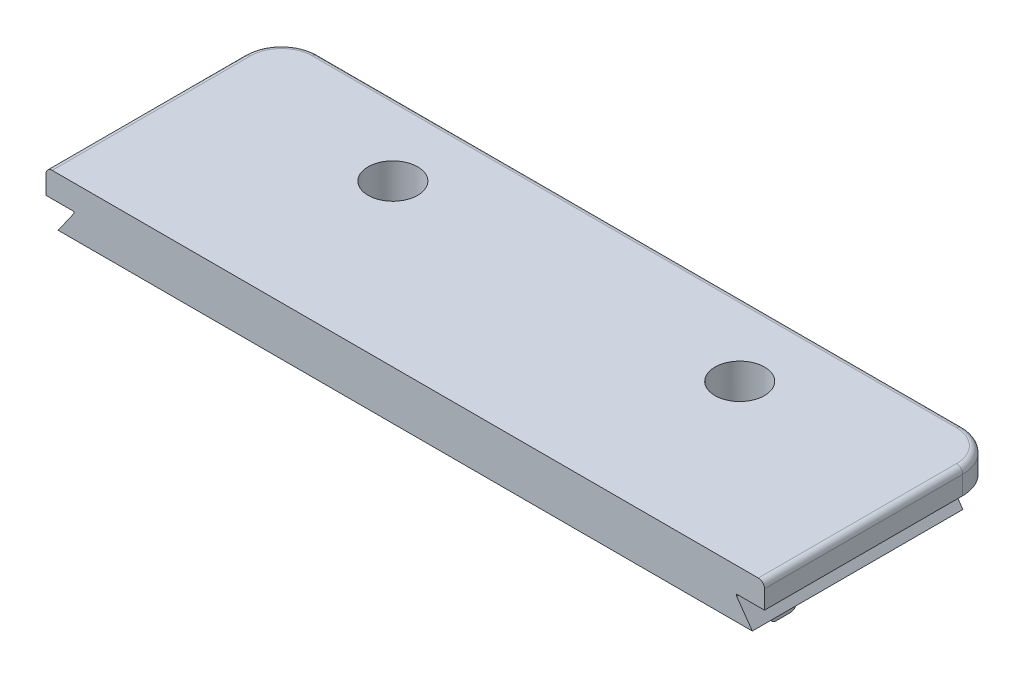
ISO-10303-21;
HEADER;
FILE_DESCRIPTION(('STEP AP214'),'2;1');
FILE_NAME('part.step','',(''),(''),'','','');
FILE_SCHEMA(('AUTOMOTIVE_DESIGN { 1 0 10303 214 1 1 1 1 }'));
ENDSEC;
DATA;
#1=APPLICATION_CONTEXT('core data for automotive mechanical design processes');
#2=APPLICATION_PROTOCOL_DEFINITION('international standard','automotive_design',2000,#1);
#3=PRODUCT_CONTEXT('',#1,'mechanical');
#4=PRODUCT('Part','Part','',(#3));
#5=PRODUCT_RELATED_PRODUCT_CATEGORY('part','',(#4));
#6=PRODUCT_DEFINITION_FORMATION('','',#4);
#7=PRODUCT_DEFINITION_CONTEXT('part definition',#1,'design');
#8=PRODUCT_DEFINITION('design','',#6,#7);
#9=PRODUCT_DEFINITION_SHAPE('','',#8);
#10=(LENGTH_UNIT() NAMED_UNIT(*) SI_UNIT(.MILLI.,.METRE.));
#11=(NAMED_UNIT(*) PLANE_ANGLE_UNIT() SI_UNIT($,.RADIAN.));
#12=(NAMED_UNIT(*) SI_UNIT($,.STERADIAN.) SOLID_ANGLE_UNIT());
#13=UNCERTAINTY_MEASURE_WITH_UNIT(LENGTH_MEASURE(1.E-05),#10,'distance_accuracy_value','');
#14=(GEOMETRIC_REPRESENTATION_CONTEXT(3) GLOBAL_UNCERTAINTY_ASSIGNED_CONTEXT((#13)) GLOBAL_UNIT_ASSIGNED_CONTEXT((#10,
#11,#12)) REPRESENTATION_CONTEXT('',''));
#15=CARTESIAN_POINT('',(0.,0.,0.));
#16=DIRECTION('',(0.,0.,1.));
#17=DIRECTION('',(1.,0.,0.));
#18=AXIS2_PLACEMENT_3D('',#15,#16,#17);
#19=CARTESIAN_POINT('',(-28.0162186510252,27.2,-75.1343487105515));
#20=DIRECTION('',(0.,-1.,0.));
#21=DIRECTION('',(1.,0.,0.));
#22=AXIS2_PLACEMENT_3D('',#19,#20,#21);
#23=PLANE('',#22);
#24=CARTESIAN_POINT('',(14.,27.2,-13.));
#25=DIRECTION('',(0.,-1.,0.));
#26=DIRECTION('',(1.,0.,0.));
#27=AXIS2_PLACEMENT_3D('',#24,#25,#26);
#28=CIRCLE('',#27,2.);
#29=CARTESIAN_POINT('',(16.,27.2,-13.));
#30=VERTEX_POINT('',#29);
#31=EDGE_CURVE('E412',#30,#30,#28,.F.);
#32=ORIENTED_EDGE('',*,*,#31,.T.);
#33=EDGE_LOOP('',(#32));
#34=FACE_BOUND('',#33,.T.);
#35=CARTESIAN_POINT('',(-14.,27.2,-13.));
#36=DIRECTION('',(0.,-1.,0.));
#37=DIRECTION('',(1.,0.,0.));
#38=AXIS2_PLACEMENT_3D('',#35,#36,#37);
#39=CIRCLE('',#38,2.);
#40=CARTESIAN_POINT('',(-12.,27.2,-13.));
#41=VERTEX_POINT('',#40);
#42=EDGE_CURVE('E406',#41,#41,#39,.F.);
#43=ORIENTED_EDGE('',*,*,#42,.T.);
#44=EDGE_LOOP('',(#43));
#45=FACE_BOUND('',#44,.T.);
#46=DIRECTION('',(1.,0.,0.));
#47=VECTOR('',#46,1.);
#48=CARTESIAN_POINT('',(28.0162186510252,27.2,-3.5));
#49=LINE('',#48,#47);
#50=CARTESIAN_POINT('',(-28.0162186510252,27.2,-3.5));
#51=VERTEX_POINT('',#50);
#52=CARTESIAN_POINT('',(28.0162186510252,27.2,-3.5));
#53=VERTEX_POINT('',#52);
#54=EDGE_CURVE('E208',#51,#53,#49,.T.);
#55=ORIENTED_EDGE('',*,*,#54,.F.);
#56=DIRECTION('',(0.,0.,1.));
#57=VECTOR('',#56,1.);
#58=CARTESIAN_POINT('',(-28.0162186510252,27.2,-75.1343487105515));
#59=LINE('',#58,#57);
#60=CARTESIAN_POINT('',(-28.0162186510252,27.2,-17.));
#61=VERTEX_POINT('',#60);
#62=EDGE_CURVE('E206',#61,#51,#59,.T.);
#63=ORIENTED_EDGE('',*,*,#62,.F.);
#64=DIRECTION('',(1.,0.,0.));
#65=VECTOR('',#64,1.);
#66=CARTESIAN_POINT('',(-28.0162186510252,27.2,-17.));
#67=LINE('',#66,#65);
#68=CARTESIAN_POINT('',(28.0162186510252,27.2,-17.));
#69=VERTEX_POINT('',#68);
#70=EDGE_CURVE('E299',#61,#69,#67,.T.);
#71=ORIENTED_EDGE('',*,*,#70,.T.);
#72=DIRECTION('',(0.,0.,1.));
#73=VECTOR('',#72,1.);
#74=CARTESIAN_POINT('',(28.0162186510252,27.2,-75.1343487105515));
#75=LINE('',#74,#73);
#76=EDGE_CURVE('E298',#69,#53,#75,.T.);
#77=ORIENTED_EDGE('',*,*,#76,.T.);
#78=EDGE_LOOP('',(#55,#63,#71,#77));
#79=FACE_BOUND('',#78,.T.);
#80=ADVANCED_FACE('F47',(#34,#45,#79),#23,.T.);
#81=CARTESIAN_POINT('',(0.,0.0499999999999902,-17.));
#82=DIRECTION('',(0.,0.,-1.));
#83=DIRECTION('',(-1.,0.,0.));
#84=AXIS2_PLACEMENT_3D('',#81,#82,#83);
#85=PLANE('',#84);
#86=DIRECTION('',(-1.,0.,0.));
#87=VECTOR('',#86,1.);
#88=CARTESIAN_POINT('',(29.,29.15,-17.));
#89=LINE('',#88,#87);
#90=CARTESIAN_POINT('',(26.7558450822477,29.15,-17.));
#91=VERTEX_POINT('',#90);
#92=CARTESIAN_POINT('',(-26.7558450822477,29.15,-17.));
#93=VERTEX_POINT('',#92);
#94=EDGE_CURVE('E236',#91,#93,#89,.T.);
#95=ORIENTED_EDGE('',*,*,#94,.F.);
#96=DIRECTION('',(0.,1.,0.));
#97=VECTOR('',#96,1.);
#98=CARTESIAN_POINT('',(26.7558450822477,29.,-17.));
#99=LINE('',#98,#97);
#100=CARTESIAN_POINT('',(26.7558450822477,29.,-17.));
#101=VERTEX_POINT('',#100);
#102=EDGE_CURVE('E288',#101,#91,#99,.T.);
#103=ORIENTED_EDGE('',*,*,#102,.F.);
#104=DIRECTION('',(-0.573576436351053,0.819152044288987,0.));
#105=VECTOR('',#104,1.);
#106=CARTESIAN_POINT('',(28.0162186510252,27.2,-17.));
#107=LINE('',#106,#105);
#108=EDGE_CURVE('E294',#69,#101,#107,.T.);
#109=ORIENTED_EDGE('',*,*,#108,.F.);
#110=ORIENTED_EDGE('',*,*,#70,.F.);
#111=DIRECTION('',(-0.573576436351054,-0.819152044288987,0.));
#112=VECTOR('',#111,1.);
#113=CARTESIAN_POINT('',(-26.7558450822477,29.,-17.));
#114=LINE('',#113,#112);
#115=CARTESIAN_POINT('',(-26.7558450822477,29.,-17.));
#116=VERTEX_POINT('',#115);
#117=EDGE_CURVE('E218',#116,#61,#114,.T.);
#118=ORIENTED_EDGE('',*,*,#117,.F.);
#119=DIRECTION('',(0.,-1.,0.));
#120=VECTOR('',#119,1.);
#121=CARTESIAN_POINT('',(-26.7558450822477,29.,-17.));
#122=LINE('',#121,#120);
#123=EDGE_CURVE('E283',#93,#116,#122,.T.);
#124=ORIENTED_EDGE('',*,*,#123,.F.);
#125=EDGE_LOOP('',(#95,#103,#109,#110,#118,#124));
#126=FACE_BOUND('',#125,.T.);
#127=ADVANCED_FACE('F434',(#126),#85,.T.);
#128=CARTESIAN_POINT('',(0.,0.,0.));
#129=DIRECTION('',(0.,0.,1.));
#130=DIRECTION('',(1.,0.,0.));
#131=AXIS2_PLACEMENT_3D('',#128,#129,#130);
#132=PLANE('',#131);
#133=DIRECTION('',(-1.,0.,0.));
#134=VECTOR('',#133,1.);
#135=CARTESIAN_POINT('',(-29.,31.15,0.));
#136=LINE('',#135,#134);
#137=CARTESIAN_POINT('',(28.5,31.15,0.));
#138=VERTEX_POINT('',#137);
#139=CARTESIAN_POINT('',(-28.5,31.15,0.));
#140=VERTEX_POINT('',#139);
#141=EDGE_CURVE('E253',#138,#140,#136,.T.);
#142=ORIENTED_EDGE('',*,*,#141,.T.);
#143=CARTESIAN_POINT('',(-28.5,30.65,0.));
#144=DIRECTION('',(0.,0.,1.));
#145=DIRECTION('',(1.,0.,0.));
#146=AXIS2_PLACEMENT_3D('',#143,#144,#145);
#147=CIRCLE('',#146,0.5);
#148=CARTESIAN_POINT('',(-29.,30.65,0.));
#149=VERTEX_POINT('',#148);
#150=EDGE_CURVE('E372',#140,#149,#147,.T.);
#151=ORIENTED_EDGE('',*,*,#150,.T.);
#152=DIRECTION('',(0.,-1.,0.));
#153=VECTOR('',#152,1.);
#154=CARTESIAN_POINT('',(-29.,29.15,0.));
#155=LINE('',#154,#153);
#156=CARTESIAN_POINT('',(-29.,29.15,0.));
#157=VERTEX_POINT('',#156);
#158=EDGE_CURVE('E250',#149,#157,#155,.T.);
#159=ORIENTED_EDGE('',*,*,#158,.T.);
#160=DIRECTION('',(1.,0.,0.));
#161=VECTOR('',#160,1.);
#162=CARTESIAN_POINT('',(-26.7558450822477,29.15,0.));
#163=LINE('',#162,#161);
#164=CARTESIAN_POINT('',(-26.7558450822477,29.15,0.));
#165=VERTEX_POINT('',#164);
#166=EDGE_CURVE('E246',#157,#165,#163,.T.);
#167=ORIENTED_EDGE('',*,*,#166,.T.);
#168=DIRECTION('',(0.,-1.,0.));
#169=VECTOR('',#168,1.);
#170=CARTESIAN_POINT('',(-26.7558450822477,29.,0.));
#171=LINE('',#170,#169);
#172=CARTESIAN_POINT('',(-26.7558450822477,29.,0.));
#173=VERTEX_POINT('',#172);
#174=EDGE_CURVE('E245',#165,#173,#171,.T.);
#175=ORIENTED_EDGE('',*,*,#174,.T.);
#176=DIRECTION('',(-0.573576436351054,-0.819152044288986,0.));
#177=VECTOR('',#176,1.);
#178=CARTESIAN_POINT('',(-26.7558450822477,29.,0.));
#179=LINE('',#178,#177);
#180=CARTESIAN_POINT('',(-28.0162186510252,27.2,0.));
#181=VERTEX_POINT('',#180);
#182=EDGE_CURVE('E275',#173,#181,#179,.T.);
#183=ORIENTED_EDGE('',*,*,#182,.T.);
#184=DIRECTION('',(1.,0.,0.));
#185=VECTOR('',#184,1.);
#186=CARTESIAN_POINT('',(-28.0162186510252,27.2,0.));
#187=LINE('',#186,#185);
#188=CARTESIAN_POINT('',(28.0162186510252,27.2,0.));
#189=VERTEX_POINT('',#188);
#190=EDGE_CURVE('E215',#181,#189,#187,.T.);
#191=ORIENTED_EDGE('',*,*,#190,.T.);
#192=DIRECTION('',(-0.573576436351053,0.819152044288987,0.));
#193=VECTOR('',#192,1.);
#194=CARTESIAN_POINT('',(28.0162186510252,27.2,0.));
#195=LINE('',#194,#193);
#196=CARTESIAN_POINT('',(26.7558450822477,29.,0.));
#197=VERTEX_POINT('',#196);
#198=EDGE_CURVE('E269',#189,#197,#195,.T.);
#199=ORIENTED_EDGE('',*,*,#198,.T.);
#200=DIRECTION('',(0.,1.,0.));
#201=VECTOR('',#200,1.);
#202=CARTESIAN_POINT('',(26.7558450822477,29.,0.));
#203=LINE('',#202,#201);
#204=CARTESIAN_POINT('',(26.7558450822477,29.15,0.));
#205=VERTEX_POINT('',#204);
#206=EDGE_CURVE('E265',#197,#205,#203,.T.);
#207=ORIENTED_EDGE('',*,*,#206,.T.);
#208=DIRECTION('',(1.,0.,0.));
#209=VECTOR('',#208,1.);
#210=CARTESIAN_POINT('',(26.7558450822477,29.15,0.));
#211=LINE('',#210,#209);
#212=CARTESIAN_POINT('',(29.,29.15,0.));
#213=VERTEX_POINT('',#212);
#214=EDGE_CURVE('E261',#205,#213,#211,.T.);
#215=ORIENTED_EDGE('',*,*,#214,.T.);
#216=DIRECTION('',(0.,1.,0.));
#217=VECTOR('',#216,1.);
#218=CARTESIAN_POINT('',(29.,29.15,0.));
#219=LINE('',#218,#217);
#220=CARTESIAN_POINT('',(29.,30.65,0.));
#221=VERTEX_POINT('',#220);
#222=EDGE_CURVE('E257',#213,#221,#219,.T.);
#223=ORIENTED_EDGE('',*,*,#222,.T.);
#224=CARTESIAN_POINT('',(28.5,30.65,0.));
#225=DIRECTION('',(0.,0.,1.));
#226=DIRECTION('',(1.,0.,0.));
#227=AXIS2_PLACEMENT_3D('',#224,#225,#226);
#228=CIRCLE('',#227,0.5);
#229=EDGE_CURVE('E369',#221,#138,#228,.T.);
#230=ORIENTED_EDGE('',*,*,#229,.T.);
#231=EDGE_LOOP('',(#142,#151,#159,#167,#175,#183,#191,#199,#207,#215,#223,#230));
#232=FACE_BOUND('',#231,.T.);
#233=ADVANCED_FACE('F443',(#232),#132,.T.);
#234=CARTESIAN_POINT('',(-26.7558450822477,29.,-75.1343487105515));
#235=DIRECTION('',(-0.819152044288986,0.573576436351054,0.));
#236=DIRECTION('',(-0.573576436351054,-0.819152044288987,0.));
#237=AXIS2_PLACEMENT_3D('',#234,#235,#236);
#238=PLANE('',#237);
#239=DIRECTION('',(0.,0.,1.));
#240=VECTOR('',#239,1.);
#241=CARTESIAN_POINT('',(-26.7558450822477,29.,-75.1343487105515));
#242=LINE('',#241,#240);
#243=EDGE_CURVE('E240',#116,#173,#242,.T.);
#244=ORIENTED_EDGE('',*,*,#243,.F.);
#245=ORIENTED_EDGE('',*,*,#117,.T.);
#246=ORIENTED_EDGE('',*,*,#62,.T.);
#247=DIRECTION('',(0.,0.,-1.));
#248=VECTOR('',#247,1.);
#249=CARTESIAN_POINT('',(-28.0162186510252,27.2,-1.50000000000001));
#250=LINE('',#249,#248);
#251=CARTESIAN_POINT('',(-28.0162186510252,27.2,-1.50000000000001));
#252=VERTEX_POINT('',#251);
#253=EDGE_CURVE('E184',#252,#51,#250,.T.);
#254=ORIENTED_EDGE('',*,*,#253,.F.);
#255=EDGE_CURVE('E202',#252,#181,#59,.T.);
#256=ORIENTED_EDGE('',*,*,#255,.T.);
#257=ORIENTED_EDGE('',*,*,#182,.F.);
#258=EDGE_LOOP('',(#244,#245,#246,#254,#256,#257));
#259=FACE_BOUND('',#258,.T.);
#260=ADVANCED_FACE('F200',(#259),#238,.T.);
#261=DIRECTION('',(-1.,0.,0.));
#262=VECTOR('',#261,1.);
#263=CARTESIAN_POINT('',(28.0162186510252,27.2,-1.5));
#264=LINE('',#263,#262);
#265=CARTESIAN_POINT('',(28.0162186510252,27.2,-1.5));
#266=VERTEX_POINT('',#265);
#267=EDGE_CURVE('E209',#266,#252,#264,.T.);
#268=ORIENTED_EDGE('',*,*,#267,.F.);
#269=EDGE_CURVE('E303',#266,#189,#75,.T.);
#270=ORIENTED_EDGE('',*,*,#269,.T.);
#271=ORIENTED_EDGE('',*,*,#190,.F.);
#272=ORIENTED_EDGE('',*,*,#255,.F.);
#273=EDGE_LOOP('',(#268,#270,#271,#272));
#274=FACE_BOUND('',#273,.T.);
#275=ADVANCED_FACE('F212',(#274),#23,.T.);
#276=CARTESIAN_POINT('',(28.0162186510252,27.2,-75.1343487105515));
#277=DIRECTION('',(0.819152044288987,0.573576436351053,0.));
#278=DIRECTION('',(-0.573576436351053,0.819152044288987,0.));
#279=AXIS2_PLACEMENT_3D('',#276,#277,#278);
#280=PLANE('',#279);
#281=ORIENTED_EDGE('',*,*,#76,.F.);
#282=ORIENTED_EDGE('',*,*,#108,.T.);
#283=DIRECTION('',(0.,0.,1.));
#284=VECTOR('',#283,1.);
#285=CARTESIAN_POINT('',(26.7558450822477,29.,-75.1343487105515));
#286=LINE('',#285,#284);
#287=EDGE_CURVE('E293',#101,#197,#286,.T.);
#288=ORIENTED_EDGE('',*,*,#287,.T.);
#289=ORIENTED_EDGE('',*,*,#198,.F.);
#290=ORIENTED_EDGE('',*,*,#269,.F.);
#291=DIRECTION('',(0.,0.,1.));
#292=VECTOR('',#291,1.);
#293=CARTESIAN_POINT('',(28.0162186510252,27.2,-1.5));
#294=LINE('',#293,#292);
#295=EDGE_CURVE('E224',#53,#266,#294,.T.);
#296=ORIENTED_EDGE('',*,*,#295,.F.);
#297=EDGE_LOOP('',(#281,#282,#288,#289,#290,#296));
#298=FACE_BOUND('',#297,.T.);
#299=ADVANCED_FACE('F430',(#298),#280,.T.);
#300=CARTESIAN_POINT('',(26.7558450822477,29.,-75.1343487105515));
#301=DIRECTION('',(1.,0.,0.));
#302=DIRECTION('',(0.,1.,0.));
#303=AXIS2_PLACEMENT_3D('',#300,#301,#302);
#304=PLANE('',#303);
#305=ORIENTED_EDGE('',*,*,#287,.F.);
#306=ORIENTED_EDGE('',*,*,#102,.T.);
#307=DIRECTION('',(0.,0.,1.));
#308=VECTOR('',#307,1.);
#309=CARTESIAN_POINT('',(26.7558450822477,29.15,-75.1343487105515));
#310=LINE('',#309,#308);
#311=EDGE_CURVE('E292',#91,#205,#310,.T.);
#312=ORIENTED_EDGE('',*,*,#311,.T.);
#313=ORIENTED_EDGE('',*,*,#206,.F.);
#314=EDGE_LOOP('',(#305,#306,#312,#313));
#315=FACE_BOUND('',#314,.T.);
#316=ADVANCED_FACE('F439',(#315),#304,.T.);
#317=CARTESIAN_POINT('',(26.7558450822477,29.15,-75.1343487105515));
#318=DIRECTION('',(0.,-1.,0.));
#319=DIRECTION('',(0.,0.,-1.));
#320=AXIS2_PLACEMENT_3D('',#317,#318,#319);
#321=PLANE('',#320);
#322=DIRECTION('',(-1.,0.,0.));
#323=VECTOR('',#322,1.);
#324=CARTESIAN_POINT('',(29.,29.15,-19.));
#325=LINE('',#324,#323);
#326=CARTESIAN_POINT('',(26.,29.15,-19.));
#327=VERTEX_POINT('',#326);
#328=CARTESIAN_POINT('',(-26.,29.15,-19.));
#329=VERTEX_POINT('',#328);
#330=EDGE_CURVE('E241',#327,#329,#325,.T.);
#331=ORIENTED_EDGE('',*,*,#330,.F.);
#332=CARTESIAN_POINT('',(26.,29.15,-16.));
#333=DIRECTION('',(0.,-1.,0.));
#334=DIRECTION('',(0.,0.,-1.));
#335=AXIS2_PLACEMENT_3D('',#332,#333,#334);
#336=CIRCLE('',#335,3.);
#337=CARTESIAN_POINT('',(29.,29.15,-16.));
#338=VERTEX_POINT('',#337);
#339=EDGE_CURVE('E331',#327,#338,#336,.T.);
#340=ORIENTED_EDGE('',*,*,#339,.T.);
#341=DIRECTION('',(0.,0.,1.));
#342=VECTOR('',#341,1.);
#343=CARTESIAN_POINT('',(29.,29.15,-75.1343487105515));
#344=LINE('',#343,#342);
#345=EDGE_CURVE('E310',#338,#213,#344,.T.);
#346=ORIENTED_EDGE('',*,*,#345,.T.);
#347=ORIENTED_EDGE('',*,*,#214,.F.);
#348=ORIENTED_EDGE('',*,*,#311,.F.);
#349=ORIENTED_EDGE('',*,*,#94,.T.);
#350=DIRECTION('',(0.,0.,1.));
#351=VECTOR('',#350,1.);
#352=CARTESIAN_POINT('',(-26.7558450822477,29.15,-75.1343487105515));
#353=LINE('',#352,#351);
#354=EDGE_CURVE('E287',#93,#165,#353,.T.);
#355=ORIENTED_EDGE('',*,*,#354,.T.);
#356=ORIENTED_EDGE('',*,*,#166,.F.);
#357=DIRECTION('',(0.,0.,1.));
#358=VECTOR('',#357,1.);
#359=CARTESIAN_POINT('',(-29.,29.15,-75.1343487105515));
#360=LINE('',#359,#358);
#361=CARTESIAN_POINT('',(-29.,29.15,-16.));
#362=VERTEX_POINT('',#361);
#363=EDGE_CURVE('E306',#362,#157,#360,.T.);
#364=ORIENTED_EDGE('',*,*,#363,.F.);
#365=CARTESIAN_POINT('',(-26.,29.15,-16.));
#366=DIRECTION('',(0.,-1.,0.));
#367=DIRECTION('',(0.,0.,-1.));
#368=AXIS2_PLACEMENT_3D('',#365,#366,#367);
#369=CIRCLE('',#368,3.);
#370=EDGE_CURVE('E328',#362,#329,#369,.T.);
#371=ORIENTED_EDGE('',*,*,#370,.T.);
#372=EDGE_LOOP('',(#331,#340,#346,#347,#348,#349,#355,#356,#364,#371));
#373=FACE_BOUND('',#372,.T.);
#374=ADVANCED_FACE('F450',(#373),#321,.T.);
#375=CARTESIAN_POINT('',(29.,29.15,-75.1343487105515));
#376=DIRECTION('',(1.,0.,0.));
#377=DIRECTION('',(0.,0.,-1.));
#378=AXIS2_PLACEMENT_3D('',#375,#376,#377);
#379=PLANE('',#378);
#380=DIRECTION('',(0.,-1.,0.));
#381=VECTOR('',#380,1.);
#382=CARTESIAN_POINT('',(29.,29.15,-16.));
#383=LINE('',#382,#381);
#384=CARTESIAN_POINT('',(29.,30.65,-16.));
#385=VERTEX_POINT('',#384);
#386=EDGE_CURVE('E334',#338,#385,#383,.F.);
#387=ORIENTED_EDGE('',*,*,#386,.T.);
#388=DIRECTION('',(0.,0.,1.));
#389=VECTOR('',#388,1.);
#390=CARTESIAN_POINT('',(29.,30.65,-75.1343487105515));
#391=LINE('',#390,#389);
#392=EDGE_CURVE('E11',#385,#221,#391,.T.);
#393=ORIENTED_EDGE('',*,*,#392,.T.);
#394=ORIENTED_EDGE('',*,*,#222,.F.);
#395=ORIENTED_EDGE('',*,*,#345,.F.);
#396=EDGE_LOOP('',(#387,#393,#394,#395));
#397=FACE_BOUND('',#396,.T.);
#398=ADVANCED_FACE('F651',(#397),#379,.T.);
#399=CARTESIAN_POINT('',(-29.,31.15,-75.1343487105515));
#400=DIRECTION('',(0.,1.,0.));
#401=DIRECTION('',(0.,0.,1.));
#402=AXIS2_PLACEMENT_3D('',#399,#400,#401);
#403=PLANE('',#402);
#404=CARTESIAN_POINT('',(14.,31.15,-13.));
#405=DIRECTION('',(0.,1.,0.));
#406=DIRECTION('',(0.,0.,1.));
#407=AXIS2_PLACEMENT_3D('',#404,#405,#406);
#408=CIRCLE('',#407,2.);
#409=CARTESIAN_POINT('',(14.,31.15,-11.));
#410=VERTEX_POINT('',#409);
#411=EDGE_CURVE('E228',#410,#410,#408,.T.);
#412=ORIENTED_EDGE('',*,*,#411,.F.);
#413=EDGE_LOOP('',(#412));
#414=FACE_BOUND('',#413,.T.);
#415=CARTESIAN_POINT('',(-14.,31.15,-13.));
#416=DIRECTION('',(0.,1.,0.));
#417=DIRECTION('',(0.,0.,-1.));
#418=AXIS2_PLACEMENT_3D('',#415,#416,#417);
#419=CIRCLE('',#418,2.);
#420=CARTESIAN_POINT('',(-14.,31.15,-15.));
#421=VERTEX_POINT('',#420);
#422=EDGE_CURVE('E400',#421,#421,#419,.T.);
#423=ORIENTED_EDGE('',*,*,#422,.F.);
#424=EDGE_LOOP('',(#423));
#425=FACE_BOUND('',#424,.T.);
#426=CARTESIAN_POINT('',(-26.,31.15,-16.));
#427=DIRECTION('',(0.,1.,0.));
#428=DIRECTION('',(0.,0.,1.));
#429=AXIS2_PLACEMENT_3D('',#426,#427,#428);
#430=CIRCLE('',#429,2.5);
#431=CARTESIAN_POINT('',(-26.,31.15,-18.5));
#432=VERTEX_POINT('',#431);
#433=CARTESIAN_POINT('',(-28.5,31.15,-16.));
#434=VERTEX_POINT('',#433);
#435=EDGE_CURVE('E362',#432,#434,#430,.T.);
#436=ORIENTED_EDGE('',*,*,#435,.T.);
#437=DIRECTION('',(0.,0.,1.));
#438=VECTOR('',#437,1.);
#439=CARTESIAN_POINT('',(-28.5,31.15,-75.1343487105515));
#440=LINE('',#439,#438);
#441=EDGE_CURVE('E365',#434,#140,#440,.T.);
#442=ORIENTED_EDGE('',*,*,#441,.T.);
#443=ORIENTED_EDGE('',*,*,#141,.F.);
#444=DIRECTION('',(0.,0.,1.));
#445=VECTOR('',#444,1.);
#446=CARTESIAN_POINT('',(28.5,31.15,-75.1343487105515));
#447=LINE('',#446,#445);
#448=CARTESIAN_POINT('',(28.5,31.15,-16.));
#449=VERTEX_POINT('',#448);
#450=EDGE_CURVE('E353',#138,#449,#447,.F.);
#451=ORIENTED_EDGE('',*,*,#450,.T.);
#452=CARTESIAN_POINT('',(26.,31.15,-16.));
#453=DIRECTION('',(0.,1.,0.));
#454=DIRECTION('',(0.,0.,1.));
#455=AXIS2_PLACEMENT_3D('',#452,#453,#454);
#456=CIRCLE('',#455,2.5);
#457=CARTESIAN_POINT('',(26.,31.15,-18.5));
#458=VERTEX_POINT('',#457);
#459=EDGE_CURVE('E356',#449,#458,#456,.T.);
#460=ORIENTED_EDGE('',*,*,#459,.T.);
#461=DIRECTION('',(1.,0.,0.));
#462=VECTOR('',#461,1.);
#463=CARTESIAN_POINT('',(-29.,31.15,-18.5));
#464=LINE('',#463,#462);
#465=EDGE_CURVE('E359',#458,#432,#464,.F.);
#466=ORIENTED_EDGE('',*,*,#465,.T.);
#467=EDGE_LOOP('',(#436,#442,#443,#451,#460,#466));
#468=FACE_BOUND('',#467,.T.);
#469=ADVANCED_FACE('F460',(#414,#425,#468),#403,.T.);
#470=CARTESIAN_POINT('',(-29.,29.15,-75.1343487105515));
#471=DIRECTION('',(-1.,0.,0.));
#472=DIRECTION('',(0.,0.,1.));
#473=AXIS2_PLACEMENT_3D('',#470,#471,#472);
#474=PLANE('',#473);
#475=ORIENTED_EDGE('',*,*,#158,.F.);
#476=DIRECTION('',(0.,0.,1.));
#477=VECTOR('',#476,1.);
#478=CARTESIAN_POINT('',(-29.,30.65,-75.1343487105515));
#479=LINE('',#478,#477);
#480=CARTESIAN_POINT('',(-29.,30.65,-16.));
#481=VERTEX_POINT('',#480);
#482=EDGE_CURVE('E375',#149,#481,#479,.F.);
#483=ORIENTED_EDGE('',*,*,#482,.T.);
#484=DIRECTION('',(0.,1.,0.));
#485=VECTOR('',#484,1.);
#486=CARTESIAN_POINT('',(-29.,29.15,-16.));
#487=LINE('',#486,#485);
#488=EDGE_CURVE('E337',#481,#362,#487,.F.);
#489=ORIENTED_EDGE('',*,*,#488,.T.);
#490=ORIENTED_EDGE('',*,*,#363,.T.);
#491=EDGE_LOOP('',(#475,#483,#489,#490));
#492=FACE_BOUND('',#491,.T.);
#493=ADVANCED_FACE('F466',(#492),#474,.T.);
#494=CARTESIAN_POINT('',(-26.7558450822477,29.,-75.1343487105515));
#495=DIRECTION('',(-1.,0.,0.));
#496=DIRECTION('',(0.,0.,1.));
#497=AXIS2_PLACEMENT_3D('',#494,#495,#496);
#498=PLANE('',#497);
#499=ORIENTED_EDGE('',*,*,#354,.F.);
#500=ORIENTED_EDGE('',*,*,#123,.T.);
#501=ORIENTED_EDGE('',*,*,#243,.T.);
#502=ORIENTED_EDGE('',*,*,#174,.F.);
#503=EDGE_LOOP('',(#499,#500,#501,#502));
#504=FACE_BOUND('',#503,.T.);
#505=ADVANCED_FACE('F447',(#504),#498,.T.);
#506=CARTESIAN_POINT('',(0.,0.0499999999999902,-19.));
#507=DIRECTION('',(0.,0.,-1.));
#508=DIRECTION('',(-1.,0.,0.));
#509=AXIS2_PLACEMENT_3D('',#506,#507,#508);
#510=PLANE('',#509);
#511=DIRECTION('',(0.,1.,0.));
#512=VECTOR('',#511,1.);
#513=CARTESIAN_POINT('',(-26.,0.0499999999999902,-19.));
#514=LINE('',#513,#512);
#515=CARTESIAN_POINT('',(-26.,30.65,-19.));
#516=VERTEX_POINT('',#515);
#517=EDGE_CURVE('E239',#329,#516,#514,.T.);
#518=ORIENTED_EDGE('',*,*,#517,.T.);
#519=DIRECTION('',(1.,0.,0.));
#520=VECTOR('',#519,1.);
#521=CARTESIAN_POINT('',(0.,30.65,-19.));
#522=LINE('',#521,#520);
#523=CARTESIAN_POINT('',(26.,30.65,-19.));
#524=VERTEX_POINT('',#523);
#525=EDGE_CURVE('E72',#516,#524,#522,.T.);
#526=ORIENTED_EDGE('',*,*,#525,.T.);
#527=DIRECTION('',(0.,-1.,0.));
#528=VECTOR('',#527,1.);
#529=CARTESIAN_POINT('',(26.,0.0499999999999902,-19.));
#530=LINE('',#529,#528);
#531=EDGE_CURVE('E325',#524,#327,#530,.T.);
#532=ORIENTED_EDGE('',*,*,#531,.T.);
#533=ORIENTED_EDGE('',*,*,#330,.T.);
#534=EDGE_LOOP('',(#518,#526,#532,#533));
#535=FACE_BOUND('',#534,.T.);
#536=ADVANCED_FACE('F481',(#535),#510,.T.);
#537=CARTESIAN_POINT('',(26.,0.0499999999999902,-16.));
#538=DIRECTION('',(0.,-1.,0.));
#539=DIRECTION('',(0.,0.,-1.));
#540=AXIS2_PLACEMENT_3D('',#537,#538,#539);
#541=CYLINDRICAL_SURFACE('',#540,3.);
#542=ORIENTED_EDGE('',*,*,#531,.F.);
#543=CARTESIAN_POINT('',(26.,30.65,-16.));
#544=DIRECTION('',(0.,1.,0.));
#545=DIRECTION('',(0.,0.,1.));
#546=AXIS2_PLACEMENT_3D('',#543,#544,#545);
#547=CIRCLE('',#546,3.);
#548=EDGE_CURVE('E57',#524,#385,#547,.F.);
#549=ORIENTED_EDGE('',*,*,#548,.T.);
#550=ORIENTED_EDGE('',*,*,#386,.F.);
#551=ORIENTED_EDGE('',*,*,#339,.F.);
#552=EDGE_LOOP('',(#542,#549,#550,#551));
#553=FACE_BOUND('',#552,.T.);
#554=ADVANCED_FACE('F512',(#553),#541,.T.);
#555=CARTESIAN_POINT('',(-26.,0.0499999999999902,-16.));
#556=DIRECTION('',(0.,1.,0.));
#557=DIRECTION('',(0.,0.,1.));
#558=AXIS2_PLACEMENT_3D('',#555,#556,#557);
#559=CYLINDRICAL_SURFACE('',#558,3.);
#560=ORIENTED_EDGE('',*,*,#488,.F.);
#561=CARTESIAN_POINT('',(-26.,30.65,-16.));
#562=DIRECTION('',(0.,1.,0.));
#563=DIRECTION('',(0.,0.,1.));
#564=AXIS2_PLACEMENT_3D('',#561,#562,#563);
#565=CIRCLE('',#564,3.);
#566=EDGE_CURVE('E378',#481,#516,#565,.F.);
#567=ORIENTED_EDGE('',*,*,#566,.T.);
#568=ORIENTED_EDGE('',*,*,#517,.F.);
#569=ORIENTED_EDGE('',*,*,#370,.F.);
#570=EDGE_LOOP('',(#560,#567,#568,#569));
#571=FACE_BOUND('',#570,.T.);
#572=ADVANCED_FACE('F479',(#571),#559,.T.);
#573=CARTESIAN_POINT('',(28.0162186510252,26.95,-1.5));
#574=DIRECTION('',(-1.,0.,0.));
#575=DIRECTION('',(0.,0.,1.));
#576=AXIS2_PLACEMENT_3D('',#573,#574,#575);
#577=PLANE('',#576);
#578=DIRECTION('',(0.,0.,1.));
#579=VECTOR('',#578,1.);
#580=CARTESIAN_POINT('',(28.0162186510252,26.95,-1.5));
#581=LINE('',#580,#579);
#582=CARTESIAN_POINT('',(28.0162186510252,26.95,-3.06698729810778));
#583=VERTEX_POINT('',#582);
#584=CARTESIAN_POINT('',(28.0162186510252,26.95,-1.93301270189222));
#585=VERTEX_POINT('',#584);
#586=EDGE_CURVE('E235',#583,#585,#581,.T.);
#587=ORIENTED_EDGE('',*,*,#586,.F.);
#588=CARTESIAN_POINT('',(28.0162186510252,27.45,-3.06698729810778));
#589=DIRECTION('',(-1.,0.,0.));
#590=DIRECTION('',(0.,0.,1.));
#591=AXIS2_PLACEMENT_3D('',#588,#589,#590);
#592=CIRCLE('',#591,0.5);
#593=EDGE_CURVE('E194',#583,#53,#592,.F.);
#594=ORIENTED_EDGE('',*,*,#593,.T.);
#595=ORIENTED_EDGE('',*,*,#295,.T.);
#596=CARTESIAN_POINT('',(28.0162186510252,27.45,-1.93301270189222));
#597=DIRECTION('',(-1.,0.,0.));
#598=DIRECTION('',(0.,0.,1.));
#599=AXIS2_PLACEMENT_3D('',#596,#597,#598);
#600=CIRCLE('',#599,0.5);
#601=EDGE_CURVE('E222',#266,#585,#600,.F.);
#602=ORIENTED_EDGE('',*,*,#601,.T.);
#603=EDGE_LOOP('',(#587,#594,#595,#602));
#604=FACE_BOUND('',#603,.T.);
#605=ADVANCED_FACE('F427',(#604),#577,.F.);
#606=CARTESIAN_POINT('',(-28.0162186510252,26.95,-1.50000000000001));
#607=DIRECTION('',(1.,0.,0.));
#608=DIRECTION('',(0.,0.,-1.));
#609=AXIS2_PLACEMENT_3D('',#606,#607,#608);
#610=PLANE('',#609);
#611=ORIENTED_EDGE('',*,*,#253,.T.);
#612=CARTESIAN_POINT('',(-28.0162186510252,27.45,-3.06698729810779));
#613=DIRECTION('',(1.,0.,0.));
#614=DIRECTION('',(0.,0.,-1.));
#615=AXIS2_PLACEMENT_3D('',#612,#613,#614);
#616=CIRCLE('',#615,0.5);
#617=CARTESIAN_POINT('',(-28.0162186510252,26.95,-3.06698729810779));
#618=VERTEX_POINT('',#617);
#619=EDGE_CURVE('E193',#51,#618,#616,.F.);
#620=ORIENTED_EDGE('',*,*,#619,.T.);
#621=DIRECTION('',(0.,0.,-1.));
#622=VECTOR('',#621,1.);
#623=CARTESIAN_POINT('',(-28.0162186510252,26.95,-1.50000000000001));
#624=LINE('',#623,#622);
#625=CARTESIAN_POINT('',(-28.0162186510252,26.95,-1.93301270189223));
#626=VERTEX_POINT('',#625);
#627=EDGE_CURVE('E187',#626,#618,#624,.T.);
#628=ORIENTED_EDGE('',*,*,#627,.F.);
#629=CARTESIAN_POINT('',(-28.0162186510252,27.45,-1.93301270189223));
#630=DIRECTION('',(1.,0.,0.));
#631=DIRECTION('',(0.,0.,-1.));
#632=AXIS2_PLACEMENT_3D('',#629,#630,#631);
#633=CIRCLE('',#632,0.5);
#634=EDGE_CURVE('E181',#626,#252,#633,.F.);
#635=ORIENTED_EDGE('',*,*,#634,.T.);
#636=EDGE_LOOP('',(#611,#620,#628,#635));
#637=FACE_BOUND('',#636,.T.);
#638=ADVANCED_FACE('F183',(#637),#610,.F.);
#639=CARTESIAN_POINT('',(0.,26.95,0.));
#640=DIRECTION('',(0.,1.,0.));
#641=DIRECTION('',(0.,0.,1.));
#642=AXIS2_PLACEMENT_3D('',#639,#640,#641);
#643=PLANE('',#642);
#644=ORIENTED_EDGE('',*,*,#627,.T.);
#645=DIRECTION('',(1.,0.,0.));
#646=VECTOR('',#645,1.);
#647=CARTESIAN_POINT('',(0.,26.95,-3.06698729810778));
#648=LINE('',#647,#646);
#649=EDGE_CURVE('E343',#618,#583,#648,.T.);
#650=ORIENTED_EDGE('',*,*,#649,.T.);
#651=ORIENTED_EDGE('',*,*,#586,.T.);
#652=DIRECTION('',(-1.,0.,0.));
#653=VECTOR('',#652,1.);
#654=CARTESIAN_POINT('',(0.,26.95,-1.93301270189223));
#655=LINE('',#654,#653);
#656=EDGE_CURVE('E340',#585,#626,#655,.T.);
#657=ORIENTED_EDGE('',*,*,#656,.T.);
#658=EDGE_LOOP('',(#644,#650,#651,#657));
#659=FACE_BOUND('',#658,.T.);
#660=ADVANCED_FACE('F421',(#659),#643,.F.);
#661=CARTESIAN_POINT('',(28.0162186510252,27.45,-3.06698729810778));
#662=DIRECTION('',(1.,0.,0.));
#663=DIRECTION('',(0.,1.,0.));
#664=AXIS2_PLACEMENT_3D('',#661,#662,#663);
#665=CYLINDRICAL_SURFACE('',#664,0.5);
#666=ORIENTED_EDGE('',*,*,#619,.F.);
#667=ORIENTED_EDGE('',*,*,#54,.T.);
#668=ORIENTED_EDGE('',*,*,#593,.F.);
#669=ORIENTED_EDGE('',*,*,#649,.F.);
#670=EDGE_LOOP('',(#666,#667,#668,#669));
#671=FACE_BOUND('',#670,.T.);
#672=ADVANCED_FACE('F424',(#671),#665,.T.);
#673=CARTESIAN_POINT('',(28.0162186510252,27.45,-1.93301270189222));
#674=DIRECTION('',(-1.,0.,0.));
#675=DIRECTION('',(0.,-1.,0.));
#676=AXIS2_PLACEMENT_3D('',#673,#674,#675);
#677=CYLINDRICAL_SURFACE('',#676,0.5);
#678=ORIENTED_EDGE('',*,*,#601,.F.);
#679=ORIENTED_EDGE('',*,*,#267,.T.);
#680=ORIENTED_EDGE('',*,*,#634,.F.);
#681=ORIENTED_EDGE('',*,*,#656,.F.);
#682=EDGE_LOOP('',(#678,#679,#680,#681));
#683=FACE_BOUND('',#682,.T.);
#684=ADVANCED_FACE('F221',(#683),#677,.T.);
#685=CARTESIAN_POINT('',(-14.,26.949,-13.));
#686=DIRECTION('',(0.,1.,0.));
#687=DIRECTION('',(0.,0.,1.));
#688=AXIS2_PLACEMENT_3D('',#685,#686,#687);
#689=CYLINDRICAL_SURFACE('',#688,2.);
#690=ORIENTED_EDGE('',*,*,#42,.F.);
#691=EDGE_LOOP('',(#690));
#692=FACE_BOUND('',#691,.T.);
#693=ORIENTED_EDGE('',*,*,#422,.T.);
#694=EDGE_LOOP('',(#693));
#695=FACE_BOUND('',#694,.T.);
#696=ADVANCED_FACE('F521',(#692,#695),#689,.F.);
#697=CARTESIAN_POINT('',(14.,26.949,-13.));
#698=DIRECTION('',(0.,1.,0.));
#699=DIRECTION('',(0.,0.,1.));
#700=AXIS2_PLACEMENT_3D('',#697,#698,#699);
#701=CYLINDRICAL_SURFACE('',#700,2.);
#702=ORIENTED_EDGE('',*,*,#31,.F.);
#703=EDGE_LOOP('',(#702));
#704=FACE_BOUND('',#703,.T.);
#705=ORIENTED_EDGE('',*,*,#411,.T.);
#706=EDGE_LOOP('',(#705));
#707=FACE_BOUND('',#706,.T.);
#708=ADVANCED_FACE('F548',(#704,#707),#701,.F.);
#709=CARTESIAN_POINT('',(28.5,30.65,-75.1343487105515));
#710=DIRECTION('',(0.,0.,1.));
#711=DIRECTION('',(1.,0.,0.));
#712=AXIS2_PLACEMENT_3D('',#709,#710,#711);
#713=CYLINDRICAL_SURFACE('',#712,0.5);
#714=ORIENTED_EDGE('',*,*,#229,.F.);
#715=ORIENTED_EDGE('',*,*,#392,.F.);
#716=CARTESIAN_POINT('',(28.5,30.65,-16.));
#717=DIRECTION('',(0.,0.,-1.));
#718=DIRECTION('',(-1.,0.,0.));
#719=AXIS2_PLACEMENT_3D('',#716,#717,#718);
#720=CIRCLE('',#719,0.5);
#721=EDGE_CURVE('E51',#449,#385,#720,.T.);
#722=ORIENTED_EDGE('',*,*,#721,.F.);
#723=ORIENTED_EDGE('',*,*,#450,.F.);
#724=EDGE_LOOP('',(#714,#715,#722,#723));
#725=FACE_BOUND('',#724,.T.);
#726=ADVANCED_FACE('F49',(#725),#713,.T.);
#727=CARTESIAN_POINT('',(26.,30.65,-16.));
#728=DIRECTION('',(0.,1.,0.));
#729=DIRECTION('',(0.,0.,1.));
#730=AXIS2_PLACEMENT_3D('',#727,#728,#729);
#731=TOROIDAL_SURFACE('',#730,2.5,0.5);
#732=ORIENTED_EDGE('',*,*,#721,.T.);
#733=ORIENTED_EDGE('',*,*,#548,.F.);
#734=CARTESIAN_POINT('',(26.,30.65,-18.5));
#735=DIRECTION('',(-1.,0.,0.));
#736=DIRECTION('',(0.,0.,1.));
#737=AXIS2_PLACEMENT_3D('',#734,#735,#736);
#738=CIRCLE('',#737,0.5);
#739=EDGE_CURVE('E392',#458,#524,#738,.T.);
#740=ORIENTED_EDGE('',*,*,#739,.F.);
#741=ORIENTED_EDGE('',*,*,#459,.F.);
#742=EDGE_LOOP('',(#732,#733,#740,#741));
#743=FACE_BOUND('',#742,.T.);
#744=ADVANCED_FACE('F484',(#743),#731,.T.);
#745=CARTESIAN_POINT('',(0.,30.65,-18.5));
#746=DIRECTION('',(1.,0.,0.));
#747=DIRECTION('',(0.,0.,-1.));
#748=AXIS2_PLACEMENT_3D('',#745,#746,#747);
#749=CYLINDRICAL_SURFACE('',#748,0.5);
#750=ORIENTED_EDGE('',*,*,#739,.T.);
#751=ORIENTED_EDGE('',*,*,#525,.F.);
#752=CARTESIAN_POINT('',(-26.,30.65,-18.5));
#753=DIRECTION('',(-1.,0.,0.));
#754=DIRECTION('',(0.,0.,1.));
#755=AXIS2_PLACEMENT_3D('',#752,#753,#754);
#756=CIRCLE('',#755,0.5);
#757=EDGE_CURVE('E389',#432,#516,#756,.T.);
#758=ORIENTED_EDGE('',*,*,#757,.F.);
#759=ORIENTED_EDGE('',*,*,#465,.F.);
#760=EDGE_LOOP('',(#750,#751,#758,#759));
#761=FACE_BOUND('',#760,.T.);
#762=ADVANCED_FACE('F482',(#761),#749,.T.);
#763=CARTESIAN_POINT('',(-26.,30.65,-16.));
#764=DIRECTION('',(0.,1.,0.));
#765=DIRECTION('',(0.,0.,1.));
#766=AXIS2_PLACEMENT_3D('',#763,#764,#765);
#767=TOROIDAL_SURFACE('',#766,2.5,0.5);
#768=ORIENTED_EDGE('',*,*,#757,.T.);
#769=ORIENTED_EDGE('',*,*,#566,.F.);
#770=CARTESIAN_POINT('',(-28.5,30.65,-16.));
#771=DIRECTION('',(0.,0.,1.));
#772=DIRECTION('',(1.,0.,0.));
#773=AXIS2_PLACEMENT_3D('',#770,#771,#772);
#774=CIRCLE('',#773,0.5);
#775=EDGE_CURVE('E385',#434,#481,#774,.T.);
#776=ORIENTED_EDGE('',*,*,#775,.F.);
#777=ORIENTED_EDGE('',*,*,#435,.F.);
#778=EDGE_LOOP('',(#768,#769,#776,#777));
#779=FACE_BOUND('',#778,.T.);
#780=ADVANCED_FACE('F475',(#779),#767,.T.);
#781=CARTESIAN_POINT('',(-28.5,30.65,-75.1343487105515));
#782=DIRECTION('',(0.,0.,1.));
#783=DIRECTION('',(1.,0.,0.));
#784=AXIS2_PLACEMENT_3D('',#781,#782,#783);
#785=CYLINDRICAL_SURFACE('',#784,0.5);
#786=ORIENTED_EDGE('',*,*,#775,.T.);
#787=ORIENTED_EDGE('',*,*,#482,.F.);
#788=ORIENTED_EDGE('',*,*,#150,.F.);
#789=ORIENTED_EDGE('',*,*,#441,.F.);
#790=EDGE_LOOP('',(#786,#787,#788,#789));
#791=FACE_BOUND('',#790,.T.);
#792=ADVANCED_FACE('F470',(#791),#785,.T.);
#793=CLOSED_SHELL('',(#80,#127,#233,#260,#275,#299,#316,#374,#398,#469,#493,#505,#536,#554,#572,
#605,#638,#660,#672,#684,#696,#708,#726,#744,#762,#780,#792));
#794=MANIFOLD_SOLID_BREP('B2',#793);
#795=ADVANCED_BREP_SHAPE_REPRESENTATION('',(#18,#794),#14);
#796=SHAPE_DEFINITION_REPRESENTATION(#9,#795);
ENDSEC;
END-ISO-10303-21;
